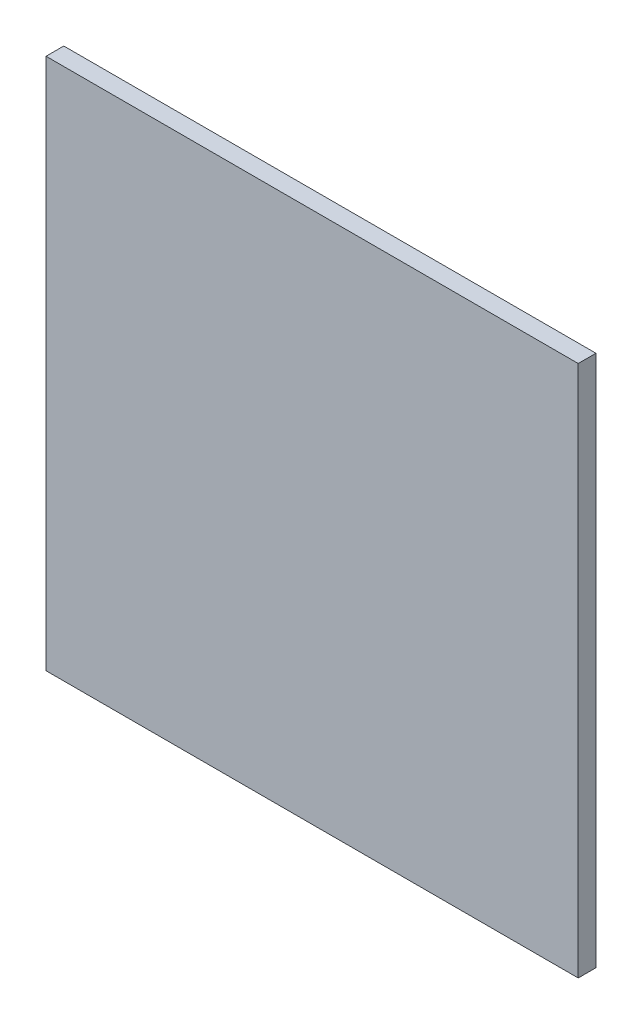
ISO-10303-21;
HEADER;
FILE_DESCRIPTION(('STEP AP214'),'2;1');
FILE_NAME('part.step','',(''),(''),'','','');
FILE_SCHEMA(('AUTOMOTIVE_DESIGN { 1 0 10303 214 1 1 1 1 }'));
ENDSEC;
DATA;
#1=APPLICATION_CONTEXT('core data for automotive mechanical design processes');
#2=APPLICATION_PROTOCOL_DEFINITION('international standard','automotive_design',2000,#1);
#3=PRODUCT_CONTEXT('',#1,'mechanical');
#4=PRODUCT('Part','Part','',(#3));
#5=PRODUCT_RELATED_PRODUCT_CATEGORY('part','',(#4));
#6=PRODUCT_DEFINITION_FORMATION('','',#4);
#7=PRODUCT_DEFINITION_CONTEXT('part definition',#1,'design');
#8=PRODUCT_DEFINITION('design','',#6,#7);
#9=PRODUCT_DEFINITION_SHAPE('','',#8);
#10=(LENGTH_UNIT() NAMED_UNIT(*) SI_UNIT(.MILLI.,.METRE.));
#11=(NAMED_UNIT(*) PLANE_ANGLE_UNIT() SI_UNIT($,.RADIAN.));
#12=(NAMED_UNIT(*) SI_UNIT($,.STERADIAN.) SOLID_ANGLE_UNIT());
#13=UNCERTAINTY_MEASURE_WITH_UNIT(LENGTH_MEASURE(1.E-05),#10,'distance_accuracy_value','');
#14=(GEOMETRIC_REPRESENTATION_CONTEXT(3) GLOBAL_UNCERTAINTY_ASSIGNED_CONTEXT((#13)) GLOBAL_UNIT_ASSIGNED_CONTEXT((#10,
#11,#12)) REPRESENTATION_CONTEXT('',''));
#15=CARTESIAN_POINT('',(0.,0.,0.));
#16=DIRECTION('',(0.,0.,1.));
#17=DIRECTION('',(1.,0.,0.));
#18=AXIS2_PLACEMENT_3D('',#15,#16,#17);
#19=CARTESIAN_POINT('',(-151.104565537555,93.2253313696613,10.));
#20=DIRECTION('',(1.,0.,0.));
#21=DIRECTION('',(0.,1.,0.));
#22=AXIS2_PLACEMENT_3D('',#19,#20,#21);
#23=PLANE('',#22);
#24=DIRECTION('',(0.,-1.,0.));
#25=VECTOR('',#24,1.);
#26=CARTESIAN_POINT('',(-151.104565537555,93.2253313696613,0.));
#27=LINE('',#26,#25);
#28=CARTESIAN_POINT('',(-151.104565537555,93.2253313696613,0.));
#29=VERTEX_POINT('',#28);
#30=CARTESIAN_POINT('',(-151.104565537555,-206.774668630339,0.));
#31=VERTEX_POINT('',#30);
#32=EDGE_CURVE('E113',#29,#31,#27,.T.);
#33=ORIENTED_EDGE('',*,*,#32,.T.);
#34=DIRECTION('',(0.,0.,-1.));
#35=VECTOR('',#34,1.);
#36=CARTESIAN_POINT('',(-151.104565537555,-206.774668630339,10.));
#37=LINE('',#36,#35);
#38=CARTESIAN_POINT('',(-151.104565537555,-206.774668630339,10.));
#39=VERTEX_POINT('',#38);
#40=EDGE_CURVE('E11',#39,#31,#37,.T.);
#41=ORIENTED_EDGE('',*,*,#40,.F.);
#42=DIRECTION('',(0.,-1.,0.));
#43=VECTOR('',#42,1.);
#44=CARTESIAN_POINT('',(-151.104565537555,93.2253313696613,10.));
#45=LINE('',#44,#43);
#46=CARTESIAN_POINT('',(-151.104565537555,93.2253313696613,10.));
#47=VERTEX_POINT('',#46);
#48=EDGE_CURVE('E97',#47,#39,#45,.T.);
#49=ORIENTED_EDGE('',*,*,#48,.F.);
#50=DIRECTION('',(0.,0.,-1.));
#51=VECTOR('',#50,1.);
#52=CARTESIAN_POINT('',(-151.104565537555,93.2253313696613,10.));
#53=LINE('',#52,#51);
#54=EDGE_CURVE('E109',#47,#29,#53,.T.);
#55=ORIENTED_EDGE('',*,*,#54,.T.);
#56=EDGE_LOOP('',(#33,#41,#49,#55));
#57=FACE_BOUND('',#56,.T.);
#58=ADVANCED_FACE('F45',(#57),#23,.F.);
#59=CARTESIAN_POINT('',(-151.104565537555,-206.774668630339,10.));
#60=DIRECTION('',(0.,1.,0.));
#61=DIRECTION('',(0.,0.,1.));
#62=AXIS2_PLACEMENT_3D('',#59,#60,#61);
#63=PLANE('',#62);
#64=DIRECTION('',(1.,0.,0.));
#65=VECTOR('',#64,1.);
#66=CARTESIAN_POINT('',(-151.104565537555,-206.774668630339,0.));
#67=LINE('',#66,#65);
#68=CARTESIAN_POINT('',(148.895434462445,-206.774668630339,0.));
#69=VERTEX_POINT('',#68);
#70=EDGE_CURVE('E102',#31,#69,#67,.T.);
#71=ORIENTED_EDGE('',*,*,#70,.T.);
#72=DIRECTION('',(0.,0.,-1.));
#73=VECTOR('',#72,1.);
#74=CARTESIAN_POINT('',(148.895434462445,-206.774668630339,10.));
#75=LINE('',#74,#73);
#76=CARTESIAN_POINT('',(148.895434462445,-206.774668630339,10.));
#77=VERTEX_POINT('',#76);
#78=EDGE_CURVE('E54',#77,#69,#75,.T.);
#79=ORIENTED_EDGE('',*,*,#78,.F.);
#80=DIRECTION('',(1.,0.,0.));
#81=VECTOR('',#80,1.);
#82=CARTESIAN_POINT('',(-151.104565537555,-206.774668630339,10.));
#83=LINE('',#82,#81);
#84=EDGE_CURVE('E92',#39,#77,#83,.T.);
#85=ORIENTED_EDGE('',*,*,#84,.F.);
#86=ORIENTED_EDGE('',*,*,#40,.T.);
#87=EDGE_LOOP('',(#71,#79,#85,#86));
#88=FACE_BOUND('',#87,.T.);
#89=ADVANCED_FACE('F101',(#88),#63,.F.);
#90=CARTESIAN_POINT('',(148.895434462445,93.2253313696613,10.));
#91=DIRECTION('',(-1.,0.,0.));
#92=DIRECTION('',(0.,-1.,0.));
#93=AXIS2_PLACEMENT_3D('',#90,#91,#92);
#94=PLANE('',#93);
#95=DIRECTION('',(0.,1.,0.));
#96=VECTOR('',#95,1.);
#97=CARTESIAN_POINT('',(148.895434462445,93.2253313696613,0.));
#98=LINE('',#97,#96);
#99=CARTESIAN_POINT('',(148.895434462445,93.2253313696613,0.));
#100=VERTEX_POINT('',#99);
#101=EDGE_CURVE('E79',#69,#100,#98,.T.);
#102=ORIENTED_EDGE('',*,*,#101,.T.);
#103=DIRECTION('',(0.,0.,-1.));
#104=VECTOR('',#103,1.);
#105=CARTESIAN_POINT('',(148.895434462445,93.2253313696613,10.));
#106=LINE('',#105,#104);
#107=CARTESIAN_POINT('',(148.895434462445,93.2253313696613,10.));
#108=VERTEX_POINT('',#107);
#109=EDGE_CURVE('E104',#108,#100,#106,.T.);
#110=ORIENTED_EDGE('',*,*,#109,.F.);
#111=DIRECTION('',(0.,1.,0.));
#112=VECTOR('',#111,1.);
#113=CARTESIAN_POINT('',(148.895434462445,93.2253313696613,10.));
#114=LINE('',#113,#112);
#115=EDGE_CURVE('E95',#77,#108,#114,.T.);
#116=ORIENTED_EDGE('',*,*,#115,.F.);
#117=ORIENTED_EDGE('',*,*,#78,.T.);
#118=EDGE_LOOP('',(#102,#110,#116,#117));
#119=FACE_BOUND('',#118,.T.);
#120=ADVANCED_FACE('F105',(#119),#94,.F.);
#121=CARTESIAN_POINT('',(-151.104565537555,93.2253313696613,10.));
#122=DIRECTION('',(0.,-1.,0.));
#123=DIRECTION('',(0.,0.,-1.));
#124=AXIS2_PLACEMENT_3D('',#121,#122,#123);
#125=PLANE('',#124);
#126=DIRECTION('',(-1.,0.,0.));
#127=VECTOR('',#126,1.);
#128=CARTESIAN_POINT('',(-151.104565537555,93.2253313696613,0.));
#129=LINE('',#128,#127);
#130=EDGE_CURVE('E85',#100,#29,#129,.T.);
#131=ORIENTED_EDGE('',*,*,#130,.T.);
#132=ORIENTED_EDGE('',*,*,#54,.F.);
#133=DIRECTION('',(-1.,0.,0.));
#134=VECTOR('',#133,1.);
#135=CARTESIAN_POINT('',(-151.104565537555,93.2253313696613,10.));
#136=LINE('',#135,#134);
#137=EDGE_CURVE('E62',#108,#47,#136,.T.);
#138=ORIENTED_EDGE('',*,*,#137,.F.);
#139=ORIENTED_EDGE('',*,*,#109,.T.);
#140=EDGE_LOOP('',(#131,#132,#138,#139));
#141=FACE_BOUND('',#140,.T.);
#142=ADVANCED_FACE('F126',(#141),#125,.F.);
#143=CARTESIAN_POINT('',(0.,0.,10.));
#144=DIRECTION('',(0.,0.,1.));
#145=DIRECTION('',(1.,0.,0.));
#146=AXIS2_PLACEMENT_3D('',#143,#144,#145);
#147=PLANE('',#146);
#148=ORIENTED_EDGE('',*,*,#48,.T.);
#149=ORIENTED_EDGE('',*,*,#84,.T.);
#150=ORIENTED_EDGE('',*,*,#115,.T.);
#151=ORIENTED_EDGE('',*,*,#137,.T.);
#152=EDGE_LOOP('',(#148,#149,#150,#151));
#153=FACE_BOUND('',#152,.T.);
#154=ADVANCED_FACE('F93',(#153),#147,.T.);
#155=CARTESIAN_POINT('',(0.,0.,0.));
#156=DIRECTION('',(0.,0.,1.));
#157=DIRECTION('',(1.,0.,0.));
#158=AXIS2_PLACEMENT_3D('',#155,#156,#157);
#159=PLANE('',#158);
#160=ORIENTED_EDGE('',*,*,#32,.F.);
#161=ORIENTED_EDGE('',*,*,#130,.F.);
#162=ORIENTED_EDGE('',*,*,#101,.F.);
#163=ORIENTED_EDGE('',*,*,#70,.F.);
#164=EDGE_LOOP('',(#160,#161,#162,#163));
#165=FACE_BOUND('',#164,.T.);
#166=ADVANCED_FACE('F129',(#165),#159,.F.);
#167=CLOSED_SHELL('',(#58,#89,#120,#142,#154,#166));
#168=MANIFOLD_SOLID_BREP('B2',#167);
#169=ADVANCED_BREP_SHAPE_REPRESENTATION('',(#18,#168),#14);
#170=SHAPE_DEFINITION_REPRESENTATION(#9,#169);
ENDSEC;
END-ISO-10303-21;
